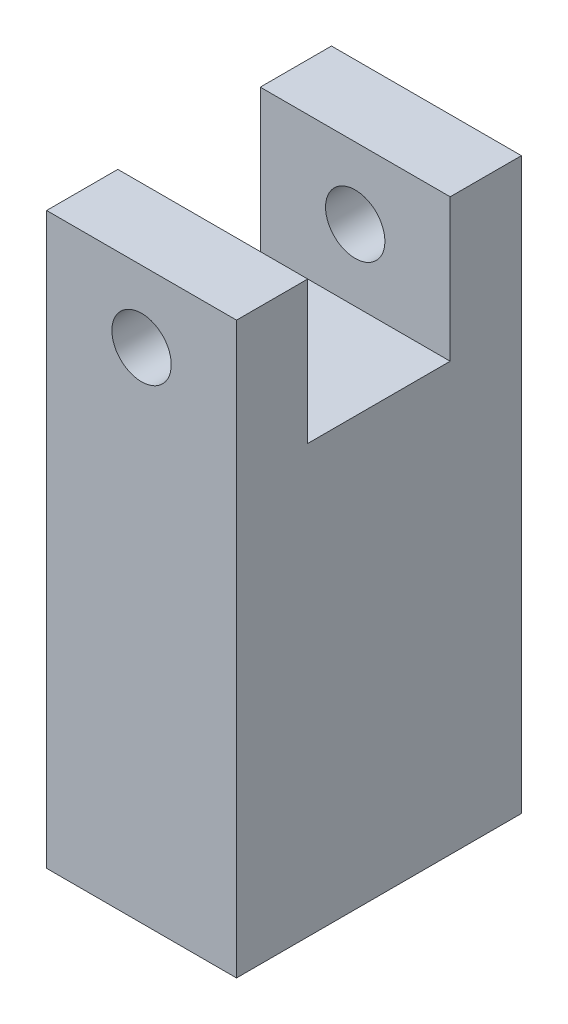
ISO-10303-21;
HEADER;
FILE_DESCRIPTION(('STEP AP214'),'2;1');
FILE_NAME('part.step','',(''),(''),'','','');
FILE_SCHEMA(('AUTOMOTIVE_DESIGN { 1 0 10303 214 1 1 1 1 }'));
ENDSEC;
DATA;
#1=APPLICATION_CONTEXT('core data for automotive mechanical design processes');
#2=APPLICATION_PROTOCOL_DEFINITION('international standard','automotive_design',2000,#1);
#3=PRODUCT_CONTEXT('',#1,'mechanical');
#4=PRODUCT('Part','Part','',(#3));
#5=PRODUCT_RELATED_PRODUCT_CATEGORY('part','',(#4));
#6=PRODUCT_DEFINITION_FORMATION('','',#4);
#7=PRODUCT_DEFINITION_CONTEXT('part definition',#1,'design');
#8=PRODUCT_DEFINITION('design','',#6,#7);
#9=PRODUCT_DEFINITION_SHAPE('','',#8);
#10=(LENGTH_UNIT() NAMED_UNIT(*) SI_UNIT(.MILLI.,.METRE.));
#11=(NAMED_UNIT(*) PLANE_ANGLE_UNIT() SI_UNIT($,.RADIAN.));
#12=(NAMED_UNIT(*) SI_UNIT($,.STERADIAN.) SOLID_ANGLE_UNIT());
#13=UNCERTAINTY_MEASURE_WITH_UNIT(LENGTH_MEASURE(1.E-05),#10,'distance_accuracy_value','');
#14=(GEOMETRIC_REPRESENTATION_CONTEXT(3) GLOBAL_UNCERTAINTY_ASSIGNED_CONTEXT((#13)) GLOBAL_UNIT_ASSIGNED_CONTEXT((#10,
#11,#12)) REPRESENTATION_CONTEXT('',''));
#15=CARTESIAN_POINT('',(0.,0.,0.));
#16=DIRECTION('',(0.,0.,1.));
#17=DIRECTION('',(1.,0.,0.));
#18=AXIS2_PLACEMENT_3D('',#15,#16,#17);
#19=CARTESIAN_POINT('',(12.7,38.1,19.05));
#20=DIRECTION('',(-1.,0.,0.));
#21=DIRECTION('',(0.,-1.,0.));
#22=AXIS2_PLACEMENT_3D('',#19,#20,#21);
#23=PLANE('',#22);
#24=DIRECTION('',(0.,-1.,0.));
#25=VECTOR('',#24,1.);
#26=CARTESIAN_POINT('',(12.7,0.,-9.52500000000001));
#27=LINE('',#26,#25);
#28=CARTESIAN_POINT('',(12.7,38.1,-9.525));
#29=VERTEX_POINT('',#28);
#30=CARTESIAN_POINT('',(12.7,19.05,-9.52500000000001));
#31=VERTEX_POINT('',#30);
#32=EDGE_CURVE('E121',#29,#31,#27,.T.);
#33=ORIENTED_EDGE('',*,*,#32,.T.);
#34=DIRECTION('',(0.,0.,-1.));
#35=VECTOR('',#34,1.);
#36=CARTESIAN_POINT('',(12.7,19.05,0.));
#37=LINE('',#36,#35);
#38=CARTESIAN_POINT('',(12.7,19.05,9.525));
#39=VERTEX_POINT('',#38);
#40=EDGE_CURVE('E135',#39,#31,#37,.T.);
#41=ORIENTED_EDGE('',*,*,#40,.F.);
#42=DIRECTION('',(0.,-1.,0.));
#43=VECTOR('',#42,1.);
#44=CARTESIAN_POINT('',(12.7,0.,9.525));
#45=LINE('',#44,#43);
#46=CARTESIAN_POINT('',(12.7,38.1,9.525));
#47=VERTEX_POINT('',#46);
#48=EDGE_CURVE('E185',#47,#39,#45,.T.);
#49=ORIENTED_EDGE('',*,*,#48,.F.);
#50=DIRECTION('',(0.,0.,-1.));
#51=VECTOR('',#50,1.);
#52=CARTESIAN_POINT('',(12.7,38.1,19.05));
#53=LINE('',#52,#51);
#54=CARTESIAN_POINT('',(12.7,38.1,19.05));
#55=VERTEX_POINT('',#54);
#56=EDGE_CURVE('E11',#55,#47,#53,.T.);
#57=ORIENTED_EDGE('',*,*,#56,.F.);
#58=DIRECTION('',(0.,1.,0.));
#59=VECTOR('',#58,1.);
#60=CARTESIAN_POINT('',(12.7,38.1,19.05));
#61=LINE('',#60,#59);
#62=CARTESIAN_POINT('',(12.7,-38.1,19.05));
#63=VERTEX_POINT('',#62);
#64=EDGE_CURVE('E155',#63,#55,#61,.T.);
#65=ORIENTED_EDGE('',*,*,#64,.F.);
#66=DIRECTION('',(0.,0.,-1.));
#67=VECTOR('',#66,1.);
#68=CARTESIAN_POINT('',(12.7,-38.1,19.05));
#69=LINE('',#68,#67);
#70=CARTESIAN_POINT('',(12.7,-38.1,-19.05));
#71=VERTEX_POINT('',#70);
#72=EDGE_CURVE('E148',#63,#71,#69,.T.);
#73=ORIENTED_EDGE('',*,*,#72,.T.);
#74=DIRECTION('',(0.,1.,0.));
#75=VECTOR('',#74,1.);
#76=CARTESIAN_POINT('',(12.7,38.1,-19.05));
#77=LINE('',#76,#75);
#78=CARTESIAN_POINT('',(12.7,38.1,-19.05));
#79=VERTEX_POINT('',#78);
#80=EDGE_CURVE('E161',#71,#79,#77,.T.);
#81=ORIENTED_EDGE('',*,*,#80,.T.);
#82=EDGE_CURVE('E50',#29,#79,#53,.T.);
#83=ORIENTED_EDGE('',*,*,#82,.F.);
#84=EDGE_LOOP('',(#33,#41,#49,#57,#65,#73,#81,#83));
#85=FACE_BOUND('',#84,.T.);
#86=ADVANCED_FACE('F41',(#85),#23,.F.);
#87=CARTESIAN_POINT('',(-12.7,38.1,19.05));
#88=DIRECTION('',(0.,-1.,0.));
#89=DIRECTION('',(0.,0.,-1.));
#90=AXIS2_PLACEMENT_3D('',#87,#88,#89);
#91=PLANE('',#90);
#92=DIRECTION('',(1.,0.,0.));
#93=VECTOR('',#92,1.);
#94=CARTESIAN_POINT('',(-12.7,38.1,-9.525));
#95=LINE('',#94,#93);
#96=CARTESIAN_POINT('',(-12.7,38.1,-9.525));
#97=VERTEX_POINT('',#96);
#98=EDGE_CURVE('E116',#97,#29,#95,.T.);
#99=ORIENTED_EDGE('',*,*,#98,.T.);
#100=ORIENTED_EDGE('',*,*,#82,.T.);
#101=DIRECTION('',(-1.,0.,0.));
#102=VECTOR('',#101,1.);
#103=CARTESIAN_POINT('',(-12.7,38.1,-19.05));
#104=LINE('',#103,#102);
#105=CARTESIAN_POINT('',(-12.7,38.1,-19.05));
#106=VERTEX_POINT('',#105);
#107=EDGE_CURVE('E139',#79,#106,#104,.T.);
#108=ORIENTED_EDGE('',*,*,#107,.T.);
#109=DIRECTION('',(0.,0.,-1.));
#110=VECTOR('',#109,1.);
#111=CARTESIAN_POINT('',(-12.7,38.1,19.05));
#112=LINE('',#111,#110);
#113=EDGE_CURVE('E130',#97,#106,#112,.T.);
#114=ORIENTED_EDGE('',*,*,#113,.F.);
#115=EDGE_LOOP('',(#99,#100,#108,#114));
#116=FACE_BOUND('',#115,.T.);
#117=ADVANCED_FACE('F137',(#116),#91,.F.);
#118=CARTESIAN_POINT('',(-12.7,38.1,19.05));
#119=DIRECTION('',(1.,0.,0.));
#120=DIRECTION('',(0.,1.,0.));
#121=AXIS2_PLACEMENT_3D('',#118,#119,#120);
#122=PLANE('',#121);
#123=DIRECTION('',(0.,-1.,0.));
#124=VECTOR('',#123,1.);
#125=CARTESIAN_POINT('',(-12.7,0.,-9.52500000000001));
#126=LINE('',#125,#124);
#127=CARTESIAN_POINT('',(-12.7,19.05,-9.52500000000001));
#128=VERTEX_POINT('',#127);
#129=EDGE_CURVE('E119',#97,#128,#126,.T.);
#130=ORIENTED_EDGE('',*,*,#129,.F.);
#131=ORIENTED_EDGE('',*,*,#113,.T.);
#132=DIRECTION('',(0.,-1.,0.));
#133=VECTOR('',#132,1.);
#134=CARTESIAN_POINT('',(-12.7,38.1,-19.05));
#135=LINE('',#134,#133);
#136=CARTESIAN_POINT('',(-12.7,-38.1,-19.05));
#137=VERTEX_POINT('',#136);
#138=EDGE_CURVE('E156',#106,#137,#135,.T.);
#139=ORIENTED_EDGE('',*,*,#138,.T.);
#140=DIRECTION('',(0.,0.,-1.));
#141=VECTOR('',#140,1.);
#142=CARTESIAN_POINT('',(-12.7,-38.1,19.05));
#143=LINE('',#142,#141);
#144=CARTESIAN_POINT('',(-12.7,-38.1,19.05));
#145=VERTEX_POINT('',#144);
#146=EDGE_CURVE('E143',#145,#137,#143,.T.);
#147=ORIENTED_EDGE('',*,*,#146,.F.);
#148=DIRECTION('',(0.,-1.,0.));
#149=VECTOR('',#148,1.);
#150=CARTESIAN_POINT('',(-12.7,38.1,19.05));
#151=LINE('',#150,#149);
#152=CARTESIAN_POINT('',(-12.7,38.1,19.05));
#153=VERTEX_POINT('',#152);
#154=EDGE_CURVE('E168',#153,#145,#151,.T.);
#155=ORIENTED_EDGE('',*,*,#154,.F.);
#156=CARTESIAN_POINT('',(-12.7,38.1,9.525));
#157=VERTEX_POINT('',#156);
#158=EDGE_CURVE('E142',#153,#157,#112,.T.);
#159=ORIENTED_EDGE('',*,*,#158,.T.);
#160=DIRECTION('',(0.,-1.,0.));
#161=VECTOR('',#160,1.);
#162=CARTESIAN_POINT('',(-12.7,0.,9.525));
#163=LINE('',#162,#161);
#164=CARTESIAN_POINT('',(-12.7,19.05,9.525));
#165=VERTEX_POINT('',#164);
#166=EDGE_CURVE('E134',#157,#165,#163,.T.);
#167=ORIENTED_EDGE('',*,*,#166,.T.);
#168=DIRECTION('',(0.,0.,-1.));
#169=VECTOR('',#168,1.);
#170=CARTESIAN_POINT('',(-12.7,19.05,0.));
#171=LINE('',#170,#169);
#172=EDGE_CURVE('E57',#165,#128,#171,.T.);
#173=ORIENTED_EDGE('',*,*,#172,.T.);
#174=EDGE_LOOP('',(#130,#131,#139,#147,#155,#159,#167,#173));
#175=FACE_BOUND('',#174,.T.);
#176=ADVANCED_FACE('F129',(#175),#122,.F.);
#177=ORIENTED_EDGE('',*,*,#56,.T.);
#178=DIRECTION('',(1.,0.,0.));
#179=VECTOR('',#178,1.);
#180=CARTESIAN_POINT('',(-12.7,38.1,9.525));
#181=LINE('',#180,#179);
#182=EDGE_CURVE('E126',#157,#47,#181,.T.);
#183=ORIENTED_EDGE('',*,*,#182,.F.);
#184=ORIENTED_EDGE('',*,*,#158,.F.);
#185=DIRECTION('',(-1.,0.,0.));
#186=VECTOR('',#185,1.);
#187=CARTESIAN_POINT('',(-12.7,38.1,19.05));
#188=LINE('',#187,#186);
#189=EDGE_CURVE('E94',#55,#153,#188,.T.);
#190=ORIENTED_EDGE('',*,*,#189,.F.);
#191=EDGE_LOOP('',(#177,#183,#184,#190));
#192=FACE_BOUND('',#191,.T.);
#193=ADVANCED_FACE('F222',(#192),#91,.F.);
#194=CARTESIAN_POINT('',(-12.7,-38.1,19.05));
#195=DIRECTION('',(0.,1.,0.));
#196=DIRECTION('',(0.,0.,1.));
#197=AXIS2_PLACEMENT_3D('',#194,#195,#196);
#198=PLANE('',#197);
#199=DIRECTION('',(1.,0.,0.));
#200=VECTOR('',#199,1.);
#201=CARTESIAN_POINT('',(-12.7,-38.1,-19.05));
#202=LINE('',#201,#200);
#203=EDGE_CURVE('E87',#137,#71,#202,.T.);
#204=ORIENTED_EDGE('',*,*,#203,.T.);
#205=ORIENTED_EDGE('',*,*,#72,.F.);
#206=DIRECTION('',(1.,0.,0.));
#207=VECTOR('',#206,1.);
#208=CARTESIAN_POINT('',(-12.7,-38.1,19.05));
#209=LINE('',#208,#207);
#210=EDGE_CURVE('E66',#145,#63,#209,.T.);
#211=ORIENTED_EDGE('',*,*,#210,.F.);
#212=ORIENTED_EDGE('',*,*,#146,.T.);
#213=EDGE_LOOP('',(#204,#205,#211,#212));
#214=FACE_BOUND('',#213,.T.);
#215=ADVANCED_FACE('F214',(#214),#198,.F.);
#216=CARTESIAN_POINT('',(0.,0.,19.05));
#217=DIRECTION('',(0.,0.,1.));
#218=DIRECTION('',(1.,0.,0.));
#219=AXIS2_PLACEMENT_3D('',#216,#217,#218);
#220=PLANE('',#219);
#221=CARTESIAN_POINT('',(0.,28.575,19.05));
#222=DIRECTION('',(0.,0.,1.));
#223=DIRECTION('',(1.,0.,0.));
#224=AXIS2_PLACEMENT_3D('',#221,#222,#223);
#225=CIRCLE('',#224,3.96875);
#226=CARTESIAN_POINT('',(3.96875,28.575,19.05));
#227=VERTEX_POINT('',#226);
#228=EDGE_CURVE('E203',#227,#227,#225,.T.);
#229=ORIENTED_EDGE('',*,*,#228,.F.);
#230=EDGE_LOOP('',(#229));
#231=FACE_BOUND('',#230,.T.);
#232=ORIENTED_EDGE('',*,*,#64,.T.);
#233=ORIENTED_EDGE('',*,*,#189,.T.);
#234=ORIENTED_EDGE('',*,*,#154,.T.);
#235=ORIENTED_EDGE('',*,*,#210,.T.);
#236=EDGE_LOOP('',(#232,#233,#234,#235));
#237=FACE_BOUND('',#236,.T.);
#238=ADVANCED_FACE('F211',(#231,#237),#220,.T.);
#239=CARTESIAN_POINT('',(0.,0.,-19.05));
#240=DIRECTION('',(0.,0.,1.));
#241=DIRECTION('',(1.,0.,0.));
#242=AXIS2_PLACEMENT_3D('',#239,#240,#241);
#243=PLANE('',#242);
#244=CARTESIAN_POINT('',(0.,28.575,-19.05));
#245=DIRECTION('',(0.,0.,1.));
#246=DIRECTION('',(1.,0.,0.));
#247=AXIS2_PLACEMENT_3D('',#244,#245,#246);
#248=CIRCLE('',#247,3.96875);
#249=CARTESIAN_POINT('',(3.96875,28.575,-19.05));
#250=VERTEX_POINT('',#249);
#251=EDGE_CURVE('E199',#250,#250,#248,.F.);
#252=ORIENTED_EDGE('',*,*,#251,.F.);
#253=EDGE_LOOP('',(#252));
#254=FACE_BOUND('',#253,.T.);
#255=ORIENTED_EDGE('',*,*,#80,.F.);
#256=ORIENTED_EDGE('',*,*,#203,.F.);
#257=ORIENTED_EDGE('',*,*,#138,.F.);
#258=ORIENTED_EDGE('',*,*,#107,.F.);
#259=EDGE_LOOP('',(#255,#256,#257,#258));
#260=FACE_BOUND('',#259,.T.);
#261=ADVANCED_FACE('F213',(#254,#260),#243,.F.);
#262=CARTESIAN_POINT('',(-12.7,0.,-9.52500000000001));
#263=DIRECTION('',(0.,0.,1.));
#264=DIRECTION('',(0.,-1.,0.));
#265=AXIS2_PLACEMENT_3D('',#262,#263,#264);
#266=PLANE('',#265);
#267=CARTESIAN_POINT('',(0.,28.575,-9.525));
#268=DIRECTION('',(0.,0.,1.));
#269=DIRECTION('',(0.,-1.,0.));
#270=AXIS2_PLACEMENT_3D('',#267,#268,#269);
#271=CIRCLE('',#270,3.96875);
#272=CARTESIAN_POINT('',(0.,24.60625,-9.525));
#273=VERTEX_POINT('',#272);
#274=EDGE_CURVE('E191',#273,#273,#271,.T.);
#275=ORIENTED_EDGE('',*,*,#274,.F.);
#276=EDGE_LOOP('',(#275));
#277=FACE_BOUND('',#276,.T.);
#278=ORIENTED_EDGE('',*,*,#32,.F.);
#279=ORIENTED_EDGE('',*,*,#98,.F.);
#280=ORIENTED_EDGE('',*,*,#129,.T.);
#281=DIRECTION('',(1.,0.,0.));
#282=VECTOR('',#281,1.);
#283=CARTESIAN_POINT('',(-12.7,19.05,-9.52500000000001));
#284=LINE('',#283,#282);
#285=EDGE_CURVE('E165',#128,#31,#284,.T.);
#286=ORIENTED_EDGE('',*,*,#285,.T.);
#287=EDGE_LOOP('',(#278,#279,#280,#286));
#288=FACE_BOUND('',#287,.T.);
#289=ADVANCED_FACE('F118',(#277,#288),#266,.T.);
#290=CARTESIAN_POINT('',(-12.7,19.05,0.));
#291=DIRECTION('',(0.,-1.,0.));
#292=DIRECTION('',(1.,0.,0.));
#293=AXIS2_PLACEMENT_3D('',#290,#291,#292);
#294=PLANE('',#293);
#295=ORIENTED_EDGE('',*,*,#40,.T.);
#296=ORIENTED_EDGE('',*,*,#285,.F.);
#297=ORIENTED_EDGE('',*,*,#172,.F.);
#298=DIRECTION('',(1.,0.,0.));
#299=VECTOR('',#298,1.);
#300=CARTESIAN_POINT('',(-12.7,19.05,9.525));
#301=LINE('',#300,#299);
#302=EDGE_CURVE('E177',#165,#39,#301,.T.);
#303=ORIENTED_EDGE('',*,*,#302,.T.);
#304=EDGE_LOOP('',(#295,#296,#297,#303));
#305=FACE_BOUND('',#304,.T.);
#306=ADVANCED_FACE('F234',(#305),#294,.F.);
#307=CARTESIAN_POINT('',(-12.7,0.,9.525));
#308=DIRECTION('',(0.,0.,1.));
#309=DIRECTION('',(0.,-1.,0.));
#310=AXIS2_PLACEMENT_3D('',#307,#308,#309);
#311=PLANE('',#310);
#312=CARTESIAN_POINT('',(0.,28.575,9.525));
#313=DIRECTION('',(0.,0.,1.));
#314=DIRECTION('',(0.,-1.,0.));
#315=AXIS2_PLACEMENT_3D('',#312,#313,#314);
#316=CIRCLE('',#315,3.96875);
#317=CARTESIAN_POINT('',(0.,24.60625,9.525));
#318=VERTEX_POINT('',#317);
#319=EDGE_CURVE('E44',#318,#318,#316,.T.);
#320=ORIENTED_EDGE('',*,*,#319,.T.);
#321=EDGE_LOOP('',(#320));
#322=FACE_BOUND('',#321,.T.);
#323=ORIENTED_EDGE('',*,*,#48,.T.);
#324=ORIENTED_EDGE('',*,*,#302,.F.);
#325=ORIENTED_EDGE('',*,*,#166,.F.);
#326=ORIENTED_EDGE('',*,*,#182,.T.);
#327=EDGE_LOOP('',(#323,#324,#325,#326));
#328=FACE_BOUND('',#327,.T.);
#329=ADVANCED_FACE('F278',(#322,#328),#311,.F.);
#330=CARTESIAN_POINT('',(0.,28.575,-30.2753201513364));
#331=DIRECTION('',(0.,0.,1.));
#332=DIRECTION('',(1.,0.,0.));
#333=AXIS2_PLACEMENT_3D('',#330,#331,#332);
#334=CYLINDRICAL_SURFACE('',#333,3.96875);
#335=ORIENTED_EDGE('',*,*,#228,.T.);
#336=EDGE_LOOP('',(#335));
#337=FACE_BOUND('',#336,.T.);
#338=ORIENTED_EDGE('',*,*,#319,.F.);
#339=EDGE_LOOP('',(#338));
#340=FACE_BOUND('',#339,.T.);
#341=ADVANCED_FACE('F208',(#337,#340),#334,.F.);
#342=ORIENTED_EDGE('',*,*,#274,.T.);
#343=EDGE_LOOP('',(#342));
#344=FACE_BOUND('',#343,.T.);
#345=ORIENTED_EDGE('',*,*,#251,.T.);
#346=EDGE_LOOP('',(#345));
#347=FACE_BOUND('',#346,.T.);
#348=ADVANCED_FACE('F292',(#344,#347),#334,.F.);
#349=CLOSED_SHELL('',(#86,#117,#176,#193,#215,#238,#261,#289,#306,#329,#341,#348));
#350=MANIFOLD_SOLID_BREP('B2',#349);
#351=ADVANCED_BREP_SHAPE_REPRESENTATION('',(#18,#350),#14);
#352=SHAPE_DEFINITION_REPRESENTATION(#9,#351);
ENDSEC;
END-ISO-10303-21;
